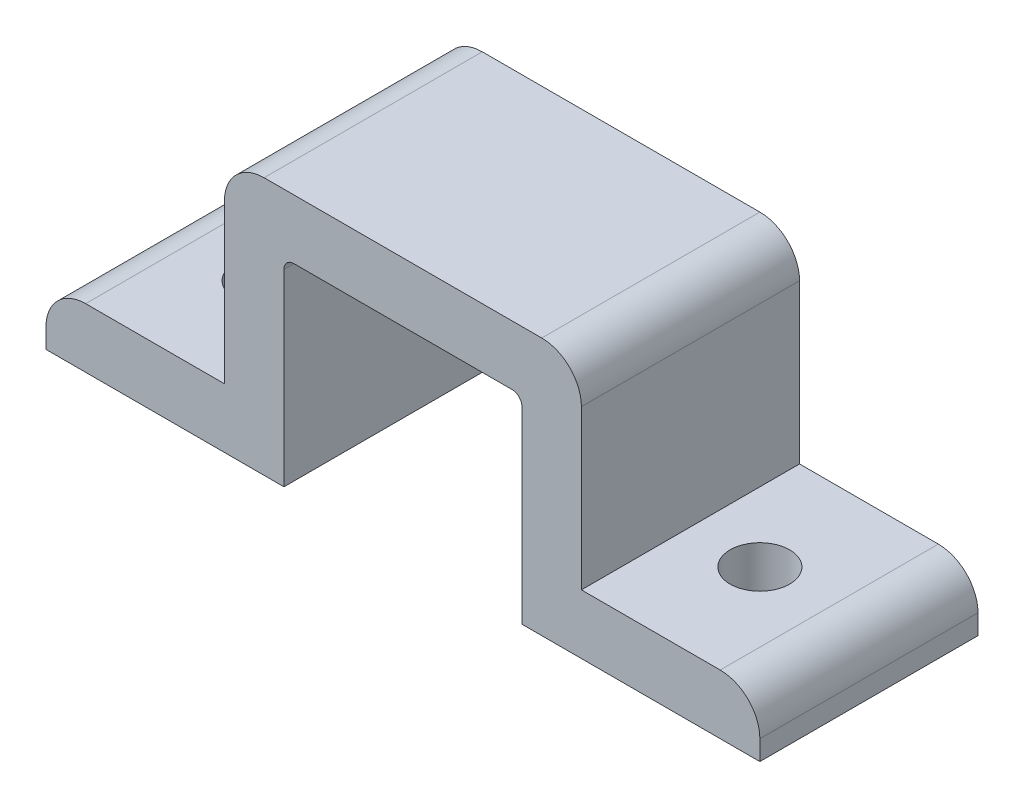
ISO-10303-21;
HEADER;
FILE_DESCRIPTION(('STEP AP214'),'2;1');
FILE_NAME('part.step','',(''),(''),'','','');
FILE_SCHEMA(('AUTOMOTIVE_DESIGN { 1 0 10303 214 1 1 1 1 }'));
ENDSEC;
DATA;
#1=APPLICATION_CONTEXT('core data for automotive mechanical design processes');
#2=APPLICATION_PROTOCOL_DEFINITION('international standard','automotive_design',2000,#1);
#3=PRODUCT_CONTEXT('',#1,'mechanical');
#4=PRODUCT('Part','Part','',(#3));
#5=PRODUCT_RELATED_PRODUCT_CATEGORY('part','',(#4));
#6=PRODUCT_DEFINITION_FORMATION('','',#4);
#7=PRODUCT_DEFINITION_CONTEXT('part definition',#1,'design');
#8=PRODUCT_DEFINITION('design','',#6,#7);
#9=PRODUCT_DEFINITION_SHAPE('','',#8);
#10=(LENGTH_UNIT() NAMED_UNIT(*) SI_UNIT(.MILLI.,.METRE.));
#11=(NAMED_UNIT(*) PLANE_ANGLE_UNIT() SI_UNIT($,.RADIAN.));
#12=(NAMED_UNIT(*) SI_UNIT($,.STERADIAN.) SOLID_ANGLE_UNIT());
#13=UNCERTAINTY_MEASURE_WITH_UNIT(LENGTH_MEASURE(1.E-05),#10,'distance_accuracy_value','');
#14=(GEOMETRIC_REPRESENTATION_CONTEXT(3) GLOBAL_UNCERTAINTY_ASSIGNED_CONTEXT((#13)) GLOBAL_UNIT_ASSIGNED_CONTEXT((#10,
#11,#12)) REPRESENTATION_CONTEXT('',''));
#15=CARTESIAN_POINT('',(0.,0.,0.));
#16=DIRECTION('',(0.,0.,1.));
#17=DIRECTION('',(1.,0.,0.));
#18=AXIS2_PLACEMENT_3D('',#15,#16,#17);
#19=CARTESIAN_POINT('',(-6.,0.,11.));
#20=DIRECTION('',(0.,1.,0.));
#21=DIRECTION('',(-1.,0.,0.));
#22=AXIS2_PLACEMENT_3D('',#19,#20,#21);
#23=PLANE('',#22);
#24=CARTESIAN_POINT('',(-12.5,0.,5.5));
#25=DIRECTION('',(0.,1.,0.));
#26=DIRECTION('',(-1.,0.,0.));
#27=AXIS2_PLACEMENT_3D('',#24,#25,#26);
#28=CIRCLE('',#27,1.5);
#29=CARTESIAN_POINT('',(-14.,0.,5.5));
#30=VERTEX_POINT('',#29);
#31=EDGE_CURVE('E279',#30,#30,#28,.F.);
#32=ORIENTED_EDGE('',*,*,#31,.F.);
#33=EDGE_LOOP('',(#32));
#34=FACE_BOUND('',#33,.T.);
#35=DIRECTION('',(1.,0.,0.));
#36=VECTOR('',#35,1.);
#37=CARTESIAN_POINT('',(-6.,0.,0.));
#38=LINE('',#37,#36);
#39=CARTESIAN_POINT('',(-18.,0.,0.));
#40=VERTEX_POINT('',#39);
#41=CARTESIAN_POINT('',(-6.,0.,0.));
#42=VERTEX_POINT('',#41);
#43=EDGE_CURVE('E181',#40,#42,#38,.T.);
#44=ORIENTED_EDGE('',*,*,#43,.T.);
#45=DIRECTION('',(0.,0.,-1.));
#46=VECTOR('',#45,1.);
#47=CARTESIAN_POINT('',(-6.,0.,11.));
#48=LINE('',#47,#46);
#49=CARTESIAN_POINT('',(-6.,0.,11.));
#50=VERTEX_POINT('',#49);
#51=EDGE_CURVE('E162',#50,#42,#48,.T.);
#52=ORIENTED_EDGE('',*,*,#51,.F.);
#53=DIRECTION('',(1.,0.,0.));
#54=VECTOR('',#53,1.);
#55=CARTESIAN_POINT('',(-6.,0.,11.));
#56=LINE('',#55,#54);
#57=CARTESIAN_POINT('',(-18.,0.,11.));
#58=VERTEX_POINT('',#57);
#59=EDGE_CURVE('E168',#58,#50,#56,.T.);
#60=ORIENTED_EDGE('',*,*,#59,.F.);
#61=DIRECTION('',(0.,0.,-1.));
#62=VECTOR('',#61,1.);
#63=CARTESIAN_POINT('',(-18.,0.,11.));
#64=LINE('',#63,#62);
#65=EDGE_CURVE('E277',#58,#40,#64,.T.);
#66=ORIENTED_EDGE('',*,*,#65,.T.);
#67=EDGE_LOOP('',(#44,#52,#60,#66));
#68=FACE_BOUND('',#67,.T.);
#69=ADVANCED_FACE('F33',(#34,#68),#23,.F.);
#70=CARTESIAN_POINT('',(-6.,10.,11.));
#71=DIRECTION('',(-1.,0.,0.));
#72=DIRECTION('',(0.,-1.,0.));
#73=AXIS2_PLACEMENT_3D('',#70,#71,#72);
#74=PLANE('',#73);
#75=DIRECTION('',(0.,1.,0.));
#76=VECTOR('',#75,1.);
#77=CARTESIAN_POINT('',(-6.,10.,0.));
#78=LINE('',#77,#76);
#79=CARTESIAN_POINT('',(-6.,9.5,0.));
#80=VERTEX_POINT('',#79);
#81=EDGE_CURVE('E249',#42,#80,#78,.T.);
#82=ORIENTED_EDGE('',*,*,#81,.T.);
#83=DIRECTION('',(0.,0.,-1.));
#84=VECTOR('',#83,1.);
#85=CARTESIAN_POINT('',(-6.,9.5,11.));
#86=LINE('',#85,#84);
#87=CARTESIAN_POINT('',(-6.,9.5,11.));
#88=VERTEX_POINT('',#87);
#89=EDGE_CURVE('E165',#80,#88,#86,.F.);
#90=ORIENTED_EDGE('',*,*,#89,.T.);
#91=DIRECTION('',(0.,1.,0.));
#92=VECTOR('',#91,1.);
#93=CARTESIAN_POINT('',(-6.,10.,11.));
#94=LINE('',#93,#92);
#95=EDGE_CURVE('E157',#50,#88,#94,.T.);
#96=ORIENTED_EDGE('',*,*,#95,.F.);
#97=ORIENTED_EDGE('',*,*,#51,.T.);
#98=EDGE_LOOP('',(#82,#90,#96,#97));
#99=FACE_BOUND('',#98,.T.);
#100=ADVANCED_FACE('F160',(#99),#74,.F.);
#101=CARTESIAN_POINT('',(6.,10.,11.));
#102=DIRECTION('',(0.,1.,0.));
#103=DIRECTION('',(0.,0.,1.));
#104=AXIS2_PLACEMENT_3D('',#101,#102,#103);
#105=PLANE('',#104);
#106=DIRECTION('',(1.,0.,0.));
#107=VECTOR('',#106,1.);
#108=CARTESIAN_POINT('',(6.,10.,11.));
#109=LINE('',#108,#107);
#110=CARTESIAN_POINT('',(-5.5,10.,11.));
#111=VERTEX_POINT('',#110);
#112=CARTESIAN_POINT('',(5.5,10.,11.));
#113=VERTEX_POINT('',#112);
#114=EDGE_CURVE('E167',#111,#113,#109,.T.);
#115=ORIENTED_EDGE('',*,*,#114,.F.);
#116=DIRECTION('',(0.,0.,-1.));
#117=VECTOR('',#116,1.);
#118=CARTESIAN_POINT('',(-5.5,10.,0.));
#119=LINE('',#118,#117);
#120=CARTESIAN_POINT('',(-5.5,10.,0.));
#121=VERTEX_POINT('',#120);
#122=EDGE_CURVE('E227',#111,#121,#119,.T.);
#123=ORIENTED_EDGE('',*,*,#122,.T.);
#124=DIRECTION('',(1.,0.,0.));
#125=VECTOR('',#124,1.);
#126=CARTESIAN_POINT('',(6.,10.,0.));
#127=LINE('',#126,#125);
#128=CARTESIAN_POINT('',(5.5,10.,0.));
#129=VERTEX_POINT('',#128);
#130=EDGE_CURVE('E242',#121,#129,#127,.T.);
#131=ORIENTED_EDGE('',*,*,#130,.T.);
#132=DIRECTION('',(0.,0.,-1.));
#133=VECTOR('',#132,1.);
#134=CARTESIAN_POINT('',(5.5,10.,11.));
#135=LINE('',#134,#133);
#136=EDGE_CURVE('E225',#129,#113,#135,.F.);
#137=ORIENTED_EDGE('',*,*,#136,.T.);
#138=EDGE_LOOP('',(#115,#123,#131,#137));
#139=FACE_BOUND('',#138,.T.);
#140=ADVANCED_FACE('F247',(#139),#105,.F.);
#141=CARTESIAN_POINT('',(6.,10.,11.));
#142=DIRECTION('',(1.,0.,0.));
#143=DIRECTION('',(0.,1.,0.));
#144=AXIS2_PLACEMENT_3D('',#141,#142,#143);
#145=PLANE('',#144);
#146=DIRECTION('',(0.,-1.,0.));
#147=VECTOR('',#146,1.);
#148=CARTESIAN_POINT('',(6.,10.,11.));
#149=LINE('',#148,#147);
#150=CARTESIAN_POINT('',(6.,9.5,11.));
#151=VERTEX_POINT('',#150);
#152=CARTESIAN_POINT('',(6.,0.,11.));
#153=VERTEX_POINT('',#152);
#154=EDGE_CURVE('E254',#151,#153,#149,.T.);
#155=ORIENTED_EDGE('',*,*,#154,.F.);
#156=DIRECTION('',(0.,0.,-1.));
#157=VECTOR('',#156,1.);
#158=CARTESIAN_POINT('',(6.,9.5,0.));
#159=LINE('',#158,#157);
#160=CARTESIAN_POINT('',(6.,9.5,0.));
#161=VERTEX_POINT('',#160);
#162=EDGE_CURVE('E231',#151,#161,#159,.T.);
#163=ORIENTED_EDGE('',*,*,#162,.T.);
#164=DIRECTION('',(0.,-1.,0.));
#165=VECTOR('',#164,1.);
#166=CARTESIAN_POINT('',(6.,10.,0.));
#167=LINE('',#166,#165);
#168=CARTESIAN_POINT('',(6.,0.,0.));
#169=VERTEX_POINT('',#168);
#170=EDGE_CURVE('E244',#161,#169,#167,.T.);
#171=ORIENTED_EDGE('',*,*,#170,.T.);
#172=DIRECTION('',(0.,0.,-1.));
#173=VECTOR('',#172,1.);
#174=CARTESIAN_POINT('',(6.,0.,11.));
#175=LINE('',#174,#173);
#176=EDGE_CURVE('E183',#153,#169,#175,.T.);
#177=ORIENTED_EDGE('',*,*,#176,.F.);
#178=EDGE_LOOP('',(#155,#163,#171,#177));
#179=FACE_BOUND('',#178,.T.);
#180=ADVANCED_FACE('F252',(#179),#145,.F.);
#181=CARTESIAN_POINT('',(6.,0.,11.));
#182=DIRECTION('',(0.,1.,0.));
#183=DIRECTION('',(-1.,0.,0.));
#184=AXIS2_PLACEMENT_3D('',#181,#182,#183);
#185=PLANE('',#184);
#186=CARTESIAN_POINT('',(12.5,0.,5.5));
#187=DIRECTION('',(0.,1.,0.));
#188=DIRECTION('',(-1.,0.,0.));
#189=AXIS2_PLACEMENT_3D('',#186,#187,#188);
#190=CIRCLE('',#189,1.5);
#191=CARTESIAN_POINT('',(11.,0.,5.5));
#192=VERTEX_POINT('',#191);
#193=EDGE_CURVE('E427',#192,#192,#190,.F.);
#194=ORIENTED_EDGE('',*,*,#193,.F.);
#195=EDGE_LOOP('',(#194));
#196=FACE_BOUND('',#195,.T.);
#197=DIRECTION('',(1.,0.,0.));
#198=VECTOR('',#197,1.);
#199=CARTESIAN_POINT('',(6.,0.,0.));
#200=LINE('',#199,#198);
#201=CARTESIAN_POINT('',(18.,0.,0.));
#202=VERTEX_POINT('',#201);
#203=EDGE_CURVE('E282',#169,#202,#200,.T.);
#204=ORIENTED_EDGE('',*,*,#203,.T.);
#205=DIRECTION('',(0.,0.,-1.));
#206=VECTOR('',#205,1.);
#207=CARTESIAN_POINT('',(18.,0.,11.));
#208=LINE('',#207,#206);
#209=CARTESIAN_POINT('',(18.,0.,11.));
#210=VERTEX_POINT('',#209);
#211=EDGE_CURVE('E189',#210,#202,#208,.T.);
#212=ORIENTED_EDGE('',*,*,#211,.F.);
#213=DIRECTION('',(1.,0.,0.));
#214=VECTOR('',#213,1.);
#215=CARTESIAN_POINT('',(6.,0.,11.));
#216=LINE('',#215,#214);
#217=EDGE_CURVE('E256',#153,#210,#216,.T.);
#218=ORIENTED_EDGE('',*,*,#217,.F.);
#219=ORIENTED_EDGE('',*,*,#176,.T.);
#220=EDGE_LOOP('',(#204,#212,#218,#219));
#221=FACE_BOUND('',#220,.T.);
#222=ADVANCED_FACE('F327',(#196,#221),#185,.F.);
#223=CARTESIAN_POINT('',(18.,0.,11.));
#224=DIRECTION('',(-1.,0.,0.));
#225=DIRECTION('',(0.,0.,1.));
#226=AXIS2_PLACEMENT_3D('',#223,#224,#225);
#227=PLANE('',#226);
#228=DIRECTION('',(0.,1.,0.));
#229=VECTOR('',#228,1.);
#230=CARTESIAN_POINT('',(18.,0.,0.));
#231=LINE('',#230,#229);
#232=CARTESIAN_POINT('',(18.,0.999999999999999,0.));
#233=VERTEX_POINT('',#232);
#234=EDGE_CURVE('E284',#202,#233,#231,.T.);
#235=ORIENTED_EDGE('',*,*,#234,.T.);
#236=DIRECTION('',(0.,0.,-1.));
#237=VECTOR('',#236,1.);
#238=CARTESIAN_POINT('',(18.,0.999999999999999,11.));
#239=LINE('',#238,#237);
#240=CARTESIAN_POINT('',(18.,0.999999999999999,11.));
#241=VERTEX_POINT('',#240);
#242=EDGE_CURVE('E223',#233,#241,#239,.F.);
#243=ORIENTED_EDGE('',*,*,#242,.T.);
#244=DIRECTION('',(0.,1.,0.));
#245=VECTOR('',#244,1.);
#246=CARTESIAN_POINT('',(18.,0.,11.));
#247=LINE('',#246,#245);
#248=EDGE_CURVE('E258',#210,#241,#247,.T.);
#249=ORIENTED_EDGE('',*,*,#248,.F.);
#250=ORIENTED_EDGE('',*,*,#211,.T.);
#251=EDGE_LOOP('',(#235,#243,#249,#250));
#252=FACE_BOUND('',#251,.T.);
#253=ADVANCED_FACE('F312',(#252),#227,.F.);
#254=CARTESIAN_POINT('',(18.,3.,11.));
#255=DIRECTION('',(0.,-1.,0.));
#256=DIRECTION('',(0.,0.,-1.));
#257=AXIS2_PLACEMENT_3D('',#254,#255,#256);
#258=PLANE('',#257);
#259=CARTESIAN_POINT('',(12.5,3.,5.5));
#260=DIRECTION('',(0.,1.,0.));
#261=DIRECTION('',(0.,0.,-1.));
#262=AXIS2_PLACEMENT_3D('',#259,#260,#261);
#263=CIRCLE('',#262,1.5);
#264=CARTESIAN_POINT('',(12.5,3.,4.));
#265=VERTEX_POINT('',#264);
#266=EDGE_CURVE('E431',#265,#265,#263,.T.);
#267=ORIENTED_EDGE('',*,*,#266,.F.);
#268=EDGE_LOOP('',(#267));
#269=FACE_BOUND('',#268,.T.);
#270=DIRECTION('',(-1.,0.,0.));
#271=VECTOR('',#270,1.);
#272=CARTESIAN_POINT('',(18.,3.,11.));
#273=LINE('',#272,#271);
#274=CARTESIAN_POINT('',(16.,3.,11.));
#275=VERTEX_POINT('',#274);
#276=CARTESIAN_POINT('',(9.,3.,11.));
#277=VERTEX_POINT('',#276);
#278=EDGE_CURVE('E264',#275,#277,#273,.T.);
#279=ORIENTED_EDGE('',*,*,#278,.F.);
#280=DIRECTION('',(0.,0.,-1.));
#281=VECTOR('',#280,1.);
#282=CARTESIAN_POINT('',(16.,3.,11.));
#283=LINE('',#282,#281);
#284=CARTESIAN_POINT('',(16.,3.,0.));
#285=VERTEX_POINT('',#284);
#286=EDGE_CURVE('E220',#275,#285,#283,.T.);
#287=ORIENTED_EDGE('',*,*,#286,.T.);
#288=DIRECTION('',(-1.,0.,0.));
#289=VECTOR('',#288,1.);
#290=CARTESIAN_POINT('',(18.,3.,0.));
#291=LINE('',#290,#289);
#292=CARTESIAN_POINT('',(9.,3.,0.));
#293=VERTEX_POINT('',#292);
#294=EDGE_CURVE('E287',#285,#293,#291,.T.);
#295=ORIENTED_EDGE('',*,*,#294,.T.);
#296=DIRECTION('',(0.,0.,-1.));
#297=VECTOR('',#296,1.);
#298=CARTESIAN_POINT('',(9.,3.,11.));
#299=LINE('',#298,#297);
#300=EDGE_CURVE('E305',#277,#293,#299,.T.);
#301=ORIENTED_EDGE('',*,*,#300,.F.);
#302=EDGE_LOOP('',(#279,#287,#295,#301));
#303=FACE_BOUND('',#302,.T.);
#304=ADVANCED_FACE('F323',(#269,#303),#258,.F.);
#305=CARTESIAN_POINT('',(9.,3.,11.));
#306=DIRECTION('',(-1.,0.,0.));
#307=DIRECTION('',(0.,0.,1.));
#308=AXIS2_PLACEMENT_3D('',#305,#306,#307);
#309=PLANE('',#308);
#310=DIRECTION('',(0.,1.,0.));
#311=VECTOR('',#310,1.);
#312=CARTESIAN_POINT('',(9.,3.,0.));
#313=LINE('',#312,#311);
#314=CARTESIAN_POINT('',(9.,11.,0.));
#315=VERTEX_POINT('',#314);
#316=EDGE_CURVE('E289',#293,#315,#313,.T.);
#317=ORIENTED_EDGE('',*,*,#316,.T.);
#318=DIRECTION('',(0.,0.,-1.));
#319=VECTOR('',#318,1.);
#320=CARTESIAN_POINT('',(9.,11.,11.));
#321=LINE('',#320,#319);
#322=CARTESIAN_POINT('',(9.,11.,11.));
#323=VERTEX_POINT('',#322);
#324=EDGE_CURVE('E218',#315,#323,#321,.F.);
#325=ORIENTED_EDGE('',*,*,#324,.T.);
#326=DIRECTION('',(0.,1.,0.));
#327=VECTOR('',#326,1.);
#328=CARTESIAN_POINT('',(9.,3.,11.));
#329=LINE('',#328,#327);
#330=EDGE_CURVE('E266',#277,#323,#329,.T.);
#331=ORIENTED_EDGE('',*,*,#330,.F.);
#332=ORIENTED_EDGE('',*,*,#300,.T.);
#333=EDGE_LOOP('',(#317,#325,#331,#332));
#334=FACE_BOUND('',#333,.T.);
#335=ADVANCED_FACE('F392',(#334),#309,.F.);
#336=CARTESIAN_POINT('',(-9.,13.,11.));
#337=DIRECTION('',(0.,-1.,0.));
#338=DIRECTION('',(0.,0.,-1.));
#339=AXIS2_PLACEMENT_3D('',#336,#337,#338);
#340=PLANE('',#339);
#341=DIRECTION('',(-1.,0.,0.));
#342=VECTOR('',#341,1.);
#343=CARTESIAN_POINT('',(-9.,13.,0.));
#344=LINE('',#343,#342);
#345=CARTESIAN_POINT('',(7.,13.,0.));
#346=VERTEX_POINT('',#345);
#347=CARTESIAN_POINT('',(-7.,13.,0.));
#348=VERTEX_POINT('',#347);
#349=EDGE_CURVE('E292',#346,#348,#344,.T.);
#350=ORIENTED_EDGE('',*,*,#349,.T.);
#351=DIRECTION('',(0.,0.,-1.));
#352=VECTOR('',#351,1.);
#353=CARTESIAN_POINT('',(-7.,13.,11.));
#354=LINE('',#353,#352);
#355=CARTESIAN_POINT('',(-7.,13.,11.));
#356=VERTEX_POINT('',#355);
#357=EDGE_CURVE('E216',#348,#356,#354,.F.);
#358=ORIENTED_EDGE('',*,*,#357,.T.);
#359=DIRECTION('',(-1.,0.,0.));
#360=VECTOR('',#359,1.);
#361=CARTESIAN_POINT('',(-9.,13.,11.));
#362=LINE('',#361,#360);
#363=CARTESIAN_POINT('',(7.,13.,11.));
#364=VERTEX_POINT('',#363);
#365=EDGE_CURVE('E269',#364,#356,#362,.T.);
#366=ORIENTED_EDGE('',*,*,#365,.F.);
#367=DIRECTION('',(0.,0.,-1.));
#368=VECTOR('',#367,1.);
#369=CARTESIAN_POINT('',(7.,13.,11.));
#370=LINE('',#369,#368);
#371=EDGE_CURVE('E213',#364,#346,#370,.T.);
#372=ORIENTED_EDGE('',*,*,#371,.T.);
#373=EDGE_LOOP('',(#350,#358,#366,#372));
#374=FACE_BOUND('',#373,.T.);
#375=ADVANCED_FACE('F387',(#374),#340,.F.);
#376=CARTESIAN_POINT('',(-9.,3.,11.));
#377=DIRECTION('',(1.,0.,0.));
#378=DIRECTION('',(0.,0.,-1.));
#379=AXIS2_PLACEMENT_3D('',#376,#377,#378);
#380=PLANE('',#379);
#381=DIRECTION('',(0.,-1.,0.));
#382=VECTOR('',#381,1.);
#383=CARTESIAN_POINT('',(-9.,3.,11.));
#384=LINE('',#383,#382);
#385=CARTESIAN_POINT('',(-9.,11.,11.));
#386=VERTEX_POINT('',#385);
#387=CARTESIAN_POINT('',(-9.,3.,11.));
#388=VERTEX_POINT('',#387);
#389=EDGE_CURVE('E272',#386,#388,#384,.T.);
#390=ORIENTED_EDGE('',*,*,#389,.F.);
#391=DIRECTION('',(0.,0.,-1.));
#392=VECTOR('',#391,1.);
#393=CARTESIAN_POINT('',(-9.,11.,11.));
#394=LINE('',#393,#392);
#395=CARTESIAN_POINT('',(-9.,11.,0.));
#396=VERTEX_POINT('',#395);
#397=EDGE_CURVE('E210',#386,#396,#394,.T.);
#398=ORIENTED_EDGE('',*,*,#397,.T.);
#399=DIRECTION('',(0.,-1.,0.));
#400=VECTOR('',#399,1.);
#401=CARTESIAN_POINT('',(-9.,3.,0.));
#402=LINE('',#401,#400);
#403=CARTESIAN_POINT('',(-9.,3.,0.));
#404=VERTEX_POINT('',#403);
#405=EDGE_CURVE('E295',#396,#404,#402,.T.);
#406=ORIENTED_EDGE('',*,*,#405,.T.);
#407=DIRECTION('',(0.,0.,-1.));
#408=VECTOR('',#407,1.);
#409=CARTESIAN_POINT('',(-9.,3.,11.));
#410=LINE('',#409,#408);
#411=EDGE_CURVE('E302',#388,#404,#410,.T.);
#412=ORIENTED_EDGE('',*,*,#411,.F.);
#413=EDGE_LOOP('',(#390,#398,#406,#412));
#414=FACE_BOUND('',#413,.T.);
#415=ADVANCED_FACE('F382',(#414),#380,.F.);
#416=CARTESIAN_POINT('',(-18.,3.,11.));
#417=DIRECTION('',(0.,-1.,0.));
#418=DIRECTION('',(0.,0.,-1.));
#419=AXIS2_PLACEMENT_3D('',#416,#417,#418);
#420=PLANE('',#419);
#421=CARTESIAN_POINT('',(-12.5,3.,5.5));
#422=DIRECTION('',(0.,1.,0.));
#423=DIRECTION('',(0.,0.,1.));
#424=AXIS2_PLACEMENT_3D('',#421,#422,#423);
#425=CIRCLE('',#424,1.5);
#426=CARTESIAN_POINT('',(-12.5,3.,7.));
#427=VERTEX_POINT('',#426);
#428=EDGE_CURVE('E426',#427,#427,#425,.T.);
#429=ORIENTED_EDGE('',*,*,#428,.F.);
#430=EDGE_LOOP('',(#429));
#431=FACE_BOUND('',#430,.T.);
#432=DIRECTION('',(-1.,0.,0.));
#433=VECTOR('',#432,1.);
#434=CARTESIAN_POINT('',(-18.,3.,0.));
#435=LINE('',#434,#433);
#436=CARTESIAN_POINT('',(-16.,3.,0.));
#437=VERTEX_POINT('',#436);
#438=EDGE_CURVE('E297',#404,#437,#435,.T.);
#439=ORIENTED_EDGE('',*,*,#438,.T.);
#440=DIRECTION('',(0.,0.,-1.));
#441=VECTOR('',#440,1.);
#442=CARTESIAN_POINT('',(-16.,3.,11.));
#443=LINE('',#442,#441);
#444=CARTESIAN_POINT('',(-16.,3.,11.));
#445=VERTEX_POINT('',#444);
#446=EDGE_CURVE('E200',#437,#445,#443,.F.);
#447=ORIENTED_EDGE('',*,*,#446,.T.);
#448=DIRECTION('',(-1.,0.,0.));
#449=VECTOR('',#448,1.);
#450=CARTESIAN_POINT('',(-18.,3.,11.));
#451=LINE('',#450,#449);
#452=EDGE_CURVE('E274',#388,#445,#451,.T.);
#453=ORIENTED_EDGE('',*,*,#452,.F.);
#454=ORIENTED_EDGE('',*,*,#411,.T.);
#455=EDGE_LOOP('',(#439,#447,#453,#454));
#456=FACE_BOUND('',#455,.T.);
#457=ADVANCED_FACE('F376',(#431,#456),#420,.F.);
#458=CARTESIAN_POINT('',(-18.,0.,11.));
#459=DIRECTION('',(1.,0.,0.));
#460=DIRECTION('',(0.,0.,-1.));
#461=AXIS2_PLACEMENT_3D('',#458,#459,#460);
#462=PLANE('',#461);
#463=DIRECTION('',(0.,-1.,0.));
#464=VECTOR('',#463,1.);
#465=CARTESIAN_POINT('',(-18.,0.,11.));
#466=LINE('',#465,#464);
#467=CARTESIAN_POINT('',(-18.,0.999999999999999,11.));
#468=VERTEX_POINT('',#467);
#469=EDGE_CURVE('E174',#468,#58,#466,.T.);
#470=ORIENTED_EDGE('',*,*,#469,.F.);
#471=DIRECTION('',(0.,0.,-1.));
#472=VECTOR('',#471,1.);
#473=CARTESIAN_POINT('',(-18.,0.999999999999999,11.));
#474=LINE('',#473,#472);
#475=CARTESIAN_POINT('',(-18.,0.999999999999999,0.));
#476=VERTEX_POINT('',#475);
#477=EDGE_CURVE('E182',#468,#476,#474,.T.);
#478=ORIENTED_EDGE('',*,*,#477,.T.);
#479=DIRECTION('',(0.,-1.,0.));
#480=VECTOR('',#479,1.);
#481=CARTESIAN_POINT('',(-18.,0.,0.));
#482=LINE('',#481,#480);
#483=EDGE_CURVE('E178',#476,#40,#482,.T.);
#484=ORIENTED_EDGE('',*,*,#483,.T.);
#485=ORIENTED_EDGE('',*,*,#65,.F.);
#486=EDGE_LOOP('',(#470,#478,#484,#485));
#487=FACE_BOUND('',#486,.T.);
#488=ADVANCED_FACE('F370',(#487),#462,.F.);
#489=CARTESIAN_POINT('',(0.,0.,11.));
#490=DIRECTION('',(0.,0.,-1.));
#491=DIRECTION('',(-1.,0.,0.));
#492=AXIS2_PLACEMENT_3D('',#489,#490,#491);
#493=PLANE('',#492);
#494=ORIENTED_EDGE('',*,*,#452,.T.);
#495=CARTESIAN_POINT('',(-16.,0.999999999999999,11.));
#496=DIRECTION('',(0.,0.,-1.));
#497=DIRECTION('',(-1.,0.,0.));
#498=AXIS2_PLACEMENT_3D('',#495,#496,#497);
#499=CIRCLE('',#498,2.);
#500=EDGE_CURVE('E208',#445,#468,#499,.F.);
#501=ORIENTED_EDGE('',*,*,#500,.T.);
#502=ORIENTED_EDGE('',*,*,#469,.T.);
#503=ORIENTED_EDGE('',*,*,#59,.T.);
#504=ORIENTED_EDGE('',*,*,#95,.T.);
#505=CARTESIAN_POINT('',(-5.5,9.5,11.));
#506=DIRECTION('',(0.,0.,-1.));
#507=DIRECTION('',(-1.,0.,0.));
#508=AXIS2_PLACEMENT_3D('',#505,#506,#507);
#509=CIRCLE('',#508,0.5);
#510=EDGE_CURVE('E235',#88,#111,#509,.T.);
#511=ORIENTED_EDGE('',*,*,#510,.T.);
#512=ORIENTED_EDGE('',*,*,#114,.T.);
#513=CARTESIAN_POINT('',(5.5,9.5,11.));
#514=DIRECTION('',(0.,0.,-1.));
#515=DIRECTION('',(-1.,0.,0.));
#516=AXIS2_PLACEMENT_3D('',#513,#514,#515);
#517=CIRCLE('',#516,0.5);
#518=EDGE_CURVE('E11',#113,#151,#517,.T.);
#519=ORIENTED_EDGE('',*,*,#518,.T.);
#520=ORIENTED_EDGE('',*,*,#154,.T.);
#521=ORIENTED_EDGE('',*,*,#217,.T.);
#522=ORIENTED_EDGE('',*,*,#248,.T.);
#523=CARTESIAN_POINT('',(16.,0.999999999999999,11.));
#524=DIRECTION('',(0.,0.,-1.));
#525=DIRECTION('',(-1.,0.,0.));
#526=AXIS2_PLACEMENT_3D('',#523,#524,#525);
#527=CIRCLE('',#526,2.);
#528=EDGE_CURVE('E202',#241,#275,#527,.F.);
#529=ORIENTED_EDGE('',*,*,#528,.T.);
#530=ORIENTED_EDGE('',*,*,#278,.T.);
#531=ORIENTED_EDGE('',*,*,#330,.T.);
#532=CARTESIAN_POINT('',(7.,11.,11.));
#533=DIRECTION('',(0.,0.,-1.));
#534=DIRECTION('',(-1.,0.,0.));
#535=AXIS2_PLACEMENT_3D('',#532,#533,#534);
#536=CIRCLE('',#535,2.);
#537=EDGE_CURVE('E204',#323,#364,#536,.F.);
#538=ORIENTED_EDGE('',*,*,#537,.T.);
#539=ORIENTED_EDGE('',*,*,#365,.T.);
#540=CARTESIAN_POINT('',(-7.,11.,11.));
#541=DIRECTION('',(0.,0.,-1.));
#542=DIRECTION('',(-1.,0.,0.));
#543=AXIS2_PLACEMENT_3D('',#540,#541,#542);
#544=CIRCLE('',#543,2.);
#545=EDGE_CURVE('E206',#356,#386,#544,.F.);
#546=ORIENTED_EDGE('',*,*,#545,.T.);
#547=ORIENTED_EDGE('',*,*,#389,.T.);
#548=EDGE_LOOP('',(#494,#501,#502,#503,#504,#511,#512,#519,#520,#521,#522,#529,#530,#531,#538,
#539,#546,#547));
#549=FACE_BOUND('',#548,.T.);
#550=ADVANCED_FACE('F172',(#549),#493,.F.);
#551=CARTESIAN_POINT('',(0.,0.,0.));
#552=DIRECTION('',(0.,0.,-1.));
#553=DIRECTION('',(-1.,0.,0.));
#554=AXIS2_PLACEMENT_3D('',#551,#552,#553);
#555=PLANE('',#554);
#556=ORIENTED_EDGE('',*,*,#483,.F.);
#557=CARTESIAN_POINT('',(-16.,0.999999999999999,0.));
#558=DIRECTION('',(0.,0.,-1.));
#559=DIRECTION('',(-1.,0.,0.));
#560=AXIS2_PLACEMENT_3D('',#557,#558,#559);
#561=CIRCLE('',#560,2.);
#562=EDGE_CURVE('E198',#476,#437,#561,.T.);
#563=ORIENTED_EDGE('',*,*,#562,.T.);
#564=ORIENTED_EDGE('',*,*,#438,.F.);
#565=ORIENTED_EDGE('',*,*,#405,.F.);
#566=CARTESIAN_POINT('',(-7.,11.,0.));
#567=DIRECTION('',(0.,0.,-1.));
#568=DIRECTION('',(-1.,0.,0.));
#569=AXIS2_PLACEMENT_3D('',#566,#567,#568);
#570=CIRCLE('',#569,2.);
#571=EDGE_CURVE('E196',#396,#348,#570,.T.);
#572=ORIENTED_EDGE('',*,*,#571,.T.);
#573=ORIENTED_EDGE('',*,*,#349,.F.);
#574=CARTESIAN_POINT('',(7.,11.,0.));
#575=DIRECTION('',(0.,0.,-1.));
#576=DIRECTION('',(-1.,0.,0.));
#577=AXIS2_PLACEMENT_3D('',#574,#575,#576);
#578=CIRCLE('',#577,2.);
#579=EDGE_CURVE('E194',#346,#315,#578,.T.);
#580=ORIENTED_EDGE('',*,*,#579,.T.);
#581=ORIENTED_EDGE('',*,*,#316,.F.);
#582=ORIENTED_EDGE('',*,*,#294,.F.);
#583=CARTESIAN_POINT('',(16.,0.999999999999999,0.));
#584=DIRECTION('',(0.,0.,-1.));
#585=DIRECTION('',(-1.,0.,0.));
#586=AXIS2_PLACEMENT_3D('',#583,#584,#585);
#587=CIRCLE('',#586,2.);
#588=EDGE_CURVE('E186',#285,#233,#587,.T.);
#589=ORIENTED_EDGE('',*,*,#588,.T.);
#590=ORIENTED_EDGE('',*,*,#234,.F.);
#591=ORIENTED_EDGE('',*,*,#203,.F.);
#592=ORIENTED_EDGE('',*,*,#170,.F.);
#593=CARTESIAN_POINT('',(5.5,9.5,0.));
#594=DIRECTION('',(0.,0.,-1.));
#595=DIRECTION('',(-1.,0.,0.));
#596=AXIS2_PLACEMENT_3D('',#593,#594,#595);
#597=CIRCLE('',#596,0.5);
#598=EDGE_CURVE('E41',#161,#129,#597,.F.);
#599=ORIENTED_EDGE('',*,*,#598,.T.);
#600=ORIENTED_EDGE('',*,*,#130,.F.);
#601=CARTESIAN_POINT('',(-5.5,9.5,0.));
#602=DIRECTION('',(0.,0.,-1.));
#603=DIRECTION('',(-1.,0.,0.));
#604=AXIS2_PLACEMENT_3D('',#601,#602,#603);
#605=CIRCLE('',#604,0.5);
#606=EDGE_CURVE('E233',#121,#80,#605,.F.);
#607=ORIENTED_EDGE('',*,*,#606,.T.);
#608=ORIENTED_EDGE('',*,*,#81,.F.);
#609=ORIENTED_EDGE('',*,*,#43,.F.);
#610=EDGE_LOOP('',(#556,#563,#564,#565,#572,#573,#580,#581,#582,#589,#590,#591,#592,#599,#600,
#607,#608,#609));
#611=FACE_BOUND('',#610,.T.);
#612=ADVANCED_FACE('F241',(#611),#555,.T.);
#613=CARTESIAN_POINT('',(-16.,0.999999999999999,11.));
#614=DIRECTION('',(0.,0.,-1.));
#615=DIRECTION('',(-1.,0.,0.));
#616=AXIS2_PLACEMENT_3D('',#613,#614,#615);
#617=CYLINDRICAL_SURFACE('',#616,2.);
#618=ORIENTED_EDGE('',*,*,#500,.F.);
#619=ORIENTED_EDGE('',*,*,#446,.F.);
#620=ORIENTED_EDGE('',*,*,#562,.F.);
#621=ORIENTED_EDGE('',*,*,#477,.F.);
#622=EDGE_LOOP('',(#618,#619,#620,#621));
#623=FACE_BOUND('',#622,.T.);
#624=ADVANCED_FACE('F348',(#623),#617,.T.);
#625=CARTESIAN_POINT('',(-7.,11.,11.));
#626=DIRECTION('',(0.,0.,-1.));
#627=DIRECTION('',(-1.,0.,0.));
#628=AXIS2_PLACEMENT_3D('',#625,#626,#627);
#629=CYLINDRICAL_SURFACE('',#628,2.);
#630=ORIENTED_EDGE('',*,*,#545,.F.);
#631=ORIENTED_EDGE('',*,*,#357,.F.);
#632=ORIENTED_EDGE('',*,*,#571,.F.);
#633=ORIENTED_EDGE('',*,*,#397,.F.);
#634=EDGE_LOOP('',(#630,#631,#632,#633));
#635=FACE_BOUND('',#634,.T.);
#636=ADVANCED_FACE('F351',(#635),#629,.T.);
#637=CARTESIAN_POINT('',(7.,11.,11.));
#638=DIRECTION('',(0.,0.,-1.));
#639=DIRECTION('',(-1.,0.,0.));
#640=AXIS2_PLACEMENT_3D('',#637,#638,#639);
#641=CYLINDRICAL_SURFACE('',#640,2.);
#642=ORIENTED_EDGE('',*,*,#537,.F.);
#643=ORIENTED_EDGE('',*,*,#324,.F.);
#644=ORIENTED_EDGE('',*,*,#579,.F.);
#645=ORIENTED_EDGE('',*,*,#371,.F.);
#646=EDGE_LOOP('',(#642,#643,#644,#645));
#647=FACE_BOUND('',#646,.T.);
#648=ADVANCED_FACE('F355',(#647),#641,.T.);
#649=CARTESIAN_POINT('',(16.,0.999999999999999,11.));
#650=DIRECTION('',(0.,0.,-1.));
#651=DIRECTION('',(-1.,0.,0.));
#652=AXIS2_PLACEMENT_3D('',#649,#650,#651);
#653=CYLINDRICAL_SURFACE('',#652,2.);
#654=ORIENTED_EDGE('',*,*,#528,.F.);
#655=ORIENTED_EDGE('',*,*,#242,.F.);
#656=ORIENTED_EDGE('',*,*,#588,.F.);
#657=ORIENTED_EDGE('',*,*,#286,.F.);
#658=EDGE_LOOP('',(#654,#655,#656,#657));
#659=FACE_BOUND('',#658,.T.);
#660=ADVANCED_FACE('F320',(#659),#653,.T.);
#661=CARTESIAN_POINT('',(-5.5,9.5,11.));
#662=DIRECTION('',(0.,0.,1.));
#663=DIRECTION('',(1.,0.,0.));
#664=AXIS2_PLACEMENT_3D('',#661,#662,#663);
#665=CYLINDRICAL_SURFACE('',#664,0.5);
#666=ORIENTED_EDGE('',*,*,#510,.F.);
#667=ORIENTED_EDGE('',*,*,#89,.F.);
#668=ORIENTED_EDGE('',*,*,#606,.F.);
#669=ORIENTED_EDGE('',*,*,#122,.F.);
#670=EDGE_LOOP('',(#666,#667,#668,#669));
#671=FACE_BOUND('',#670,.T.);
#672=ADVANCED_FACE('F361',(#671),#665,.F.);
#673=CARTESIAN_POINT('',(5.5,9.5,11.));
#674=DIRECTION('',(0.,0.,1.));
#675=DIRECTION('',(1.,0.,0.));
#676=AXIS2_PLACEMENT_3D('',#673,#674,#675);
#677=CYLINDRICAL_SURFACE('',#676,0.5);
#678=ORIENTED_EDGE('',*,*,#518,.F.);
#679=ORIENTED_EDGE('',*,*,#136,.F.);
#680=ORIENTED_EDGE('',*,*,#598,.F.);
#681=ORIENTED_EDGE('',*,*,#162,.F.);
#682=EDGE_LOOP('',(#678,#679,#680,#681));
#683=FACE_BOUND('',#682,.T.);
#684=ADVANCED_FACE('F35',(#683),#677,.F.);
#685=CARTESIAN_POINT('',(-12.5,-4.24264068711929,5.5));
#686=DIRECTION('',(0.,1.,0.));
#687=DIRECTION('',(0.,0.,1.));
#688=AXIS2_PLACEMENT_3D('',#685,#686,#687);
#689=CYLINDRICAL_SURFACE('',#688,1.5);
#690=ORIENTED_EDGE('',*,*,#31,.T.);
#691=EDGE_LOOP('',(#690));
#692=FACE_BOUND('',#691,.T.);
#693=ORIENTED_EDGE('',*,*,#428,.T.);
#694=EDGE_LOOP('',(#693));
#695=FACE_BOUND('',#694,.T.);
#696=ADVANCED_FACE('F367',(#692,#695),#689,.F.);
#697=CARTESIAN_POINT('',(12.5,-4.24264068711929,5.5));
#698=DIRECTION('',(0.,1.,0.));
#699=DIRECTION('',(0.,0.,1.));
#700=AXIS2_PLACEMENT_3D('',#697,#698,#699);
#701=CYLINDRICAL_SURFACE('',#700,1.5);
#702=ORIENTED_EDGE('',*,*,#193,.T.);
#703=EDGE_LOOP('',(#702));
#704=FACE_BOUND('',#703,.T.);
#705=ORIENTED_EDGE('',*,*,#266,.T.);
#706=EDGE_LOOP('',(#705));
#707=FACE_BOUND('',#706,.T.);
#708=ADVANCED_FACE('F414',(#704,#707),#701,.F.);
#709=CLOSED_SHELL('',(#69,#100,#140,#180,#222,#253,#304,#335,#375,#415,#457,#488,#550,#612,#624,
#636,#648,#660,#672,#684,#696,#708));
#710=MANIFOLD_SOLID_BREP('B2',#709);
#711=ADVANCED_BREP_SHAPE_REPRESENTATION('',(#18,#710),#14);
#712=SHAPE_DEFINITION_REPRESENTATION(#9,#711);
ENDSEC;
END-ISO-10303-21;
